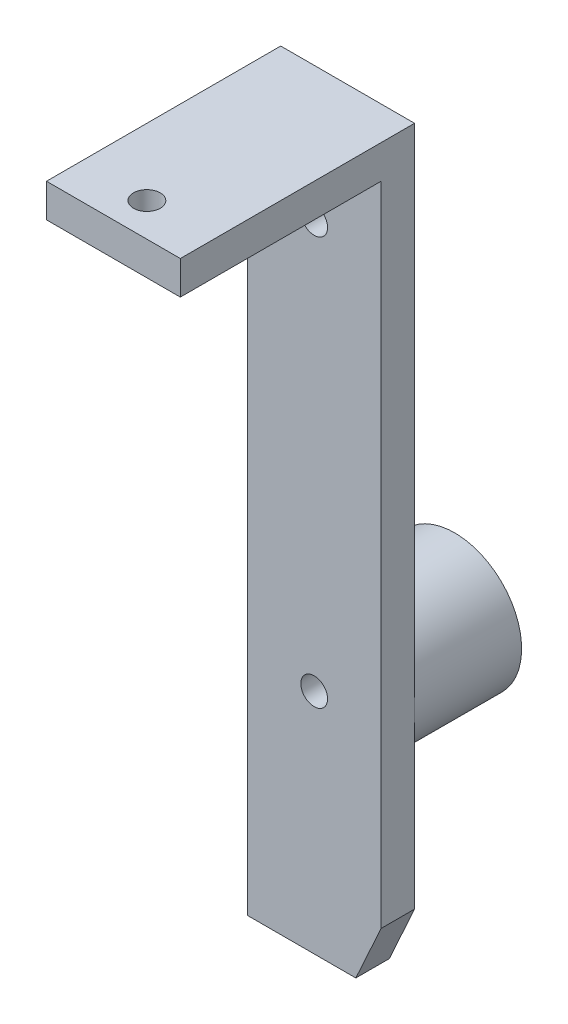
ISO-10303-21;
HEADER;
FILE_DESCRIPTION(('STEP AP214'),'2;1');
FILE_NAME('part.step','',(''),(''),'','','');
FILE_SCHEMA(('AUTOMOTIVE_DESIGN { 1 0 10303 214 1 1 1 1 }'));
ENDSEC;
DATA;
#1=APPLICATION_CONTEXT('core data for automotive mechanical design processes');
#2=APPLICATION_PROTOCOL_DEFINITION('international standard','automotive_design',2000,#1);
#3=PRODUCT_CONTEXT('',#1,'mechanical');
#4=PRODUCT('Part','Part','',(#3));
#5=PRODUCT_RELATED_PRODUCT_CATEGORY('part','',(#4));
#6=PRODUCT_DEFINITION_FORMATION('','',#4);
#7=PRODUCT_DEFINITION_CONTEXT('part definition',#1,'design');
#8=PRODUCT_DEFINITION('design','',#6,#7);
#9=PRODUCT_DEFINITION_SHAPE('','',#8);
#10=(LENGTH_UNIT() NAMED_UNIT(*) SI_UNIT(.MILLI.,.METRE.));
#11=(NAMED_UNIT(*) PLANE_ANGLE_UNIT() SI_UNIT($,.RADIAN.));
#12=(NAMED_UNIT(*) SI_UNIT($,.STERADIAN.) SOLID_ANGLE_UNIT());
#13=UNCERTAINTY_MEASURE_WITH_UNIT(LENGTH_MEASURE(1.E-05),#10,'distance_accuracy_value','');
#14=(GEOMETRIC_REPRESENTATION_CONTEXT(3) GLOBAL_UNCERTAINTY_ASSIGNED_CONTEXT((#13)) GLOBAL_UNIT_ASSIGNED_CONTEXT((#10,
#11,#12)) REPRESENTATION_CONTEXT('',''));
#15=CARTESIAN_POINT('',(0.,0.,0.));
#16=DIRECTION('',(0.,0.,1.));
#17=DIRECTION('',(1.,0.,0.));
#18=AXIS2_PLACEMENT_3D('',#15,#16,#17);
#19=CARTESIAN_POINT('',(6.35,69.85,-1.5875));
#20=DIRECTION('',(0.,0.,1.));
#21=DIRECTION('',(1.,0.,0.));
#22=AXIS2_PLACEMENT_3D('',#19,#20,#21);
#23=PLANE('',#22);
#24=CARTESIAN_POINT('',(0.,21.59,-1.5875));
#25=DIRECTION('',(0.,0.,-1.));
#26=DIRECTION('',(-1.,0.,0.));
#27=AXIS2_PLACEMENT_3D('',#24,#25,#26);
#28=CIRCLE('',#27,6.35);
#29=CARTESIAN_POINT('',(-6.34999999999999,21.59,-1.5875));
#30=VERTEX_POINT('',#29);
#31=CARTESIAN_POINT('',(6.35,21.59,-1.5875));
#32=VERTEX_POINT('',#31);
#33=EDGE_CURVE('E202',#30,#32,#28,.T.);
#34=ORIENTED_EDGE('',*,*,#33,.F.);
#35=DIRECTION('',(0.,-1.,0.));
#36=VECTOR('',#35,1.);
#37=CARTESIAN_POINT('',(-6.35,69.85,-1.5875));
#38=LINE('',#37,#36);
#39=CARTESIAN_POINT('',(-6.35,69.85,-1.5875));
#40=VERTEX_POINT('',#39);
#41=EDGE_CURVE('E135',#40,#30,#38,.T.);
#42=ORIENTED_EDGE('',*,*,#41,.F.);
#43=DIRECTION('',(-1.,0.,0.));
#44=VECTOR('',#43,1.);
#45=CARTESIAN_POINT('',(6.35,69.85,-1.5875));
#46=LINE('',#45,#44);
#47=CARTESIAN_POINT('',(6.35,69.85,-1.5875));
#48=VERTEX_POINT('',#47);
#49=EDGE_CURVE('E150',#48,#40,#46,.T.);
#50=ORIENTED_EDGE('',*,*,#49,.F.);
#51=DIRECTION('',(0.,-1.,0.));
#52=VECTOR('',#51,1.);
#53=CARTESIAN_POINT('',(6.35,69.85,-1.5875));
#54=LINE('',#53,#52);
#55=EDGE_CURVE('E127',#48,#32,#54,.T.);
#56=ORIENTED_EDGE('',*,*,#55,.T.);
#57=EDGE_LOOP('',(#34,#42,#50,#56));
#58=FACE_BOUND('',#57,.T.);
#59=CARTESIAN_POINT('',(0.,60.325,-1.5875));
#60=DIRECTION('',(0.,0.,1.));
#61=DIRECTION('',(1.,0.,0.));
#62=AXIS2_PLACEMENT_3D('',#59,#60,#61);
#63=CIRCLE('',#62,1.27);
#64=CARTESIAN_POINT('',(1.27,60.325,-1.5875));
#65=VERTEX_POINT('',#64);
#66=EDGE_CURVE('E194',#65,#65,#63,.T.);
#67=ORIENTED_EDGE('',*,*,#66,.T.);
#68=EDGE_LOOP('',(#67));
#69=FACE_BOUND('',#68,.T.);
#70=ADVANCED_FACE('F39',(#58,#69),#23,.F.);
#71=CARTESIAN_POINT('',(6.35,69.85,1.5875));
#72=DIRECTION('',(0.,0.,-1.));
#73=DIRECTION('',(-1.,0.,0.));
#74=AXIS2_PLACEMENT_3D('',#71,#72,#73);
#75=PLANE('',#74);
#76=CARTESIAN_POINT('',(0.,21.59,1.5875));
#77=DIRECTION('',(0.,0.,1.));
#78=DIRECTION('',(1.,0.,0.));
#79=AXIS2_PLACEMENT_3D('',#76,#77,#78);
#80=CIRCLE('',#79,1.27);
#81=CARTESIAN_POINT('',(1.27000000000001,21.59,1.5875));
#82=VERTEX_POINT('',#81);
#83=EDGE_CURVE('E186',#82,#82,#80,.T.);
#84=ORIENTED_EDGE('',*,*,#83,.F.);
#85=EDGE_LOOP('',(#84));
#86=FACE_BOUND('',#85,.T.);
#87=CARTESIAN_POINT('',(0.,60.325,1.5875));
#88=DIRECTION('',(0.,0.,1.));
#89=DIRECTION('',(1.,0.,0.));
#90=AXIS2_PLACEMENT_3D('',#87,#88,#89);
#91=CIRCLE('',#90,1.27);
#92=CARTESIAN_POINT('',(1.27,60.325,1.5875));
#93=VERTEX_POINT('',#92);
#94=EDGE_CURVE('E190',#93,#93,#91,.T.);
#95=ORIENTED_EDGE('',*,*,#94,.F.);
#96=EDGE_LOOP('',(#95));
#97=FACE_BOUND('',#96,.T.);
#98=DIRECTION('',(1.,0.,0.));
#99=VECTOR('',#98,1.);
#100=CARTESIAN_POINT('',(6.35,0.,1.5875));
#101=LINE('',#100,#99);
#102=CARTESIAN_POINT('',(-6.35,0.,1.5875));
#103=VERTEX_POINT('',#102);
#104=CARTESIAN_POINT('',(3.95148272282649,0.,1.5875));
#105=VERTEX_POINT('',#104);
#106=EDGE_CURVE('E117',#103,#105,#101,.T.);
#107=ORIENTED_EDGE('',*,*,#106,.T.);
#108=DIRECTION('',(-0.414132590750487,-0.910216566141426,0.));
#109=VECTOR('',#108,1.);
#110=CARTESIAN_POINT('',(3.95148272282649,0.,1.5875));
#111=LINE('',#110,#109);
#112=CARTESIAN_POINT('',(6.35,5.27166952956644,1.5875));
#113=VERTEX_POINT('',#112);
#114=EDGE_CURVE('E55',#113,#105,#111,.T.);
#115=ORIENTED_EDGE('',*,*,#114,.F.);
#116=DIRECTION('',(0.,-1.,0.));
#117=VECTOR('',#116,1.);
#118=CARTESIAN_POINT('',(6.35,69.85,1.5875));
#119=LINE('',#118,#117);
#120=CARTESIAN_POINT('',(6.35,66.675,1.5875));
#121=VERTEX_POINT('',#120);
#122=EDGE_CURVE('E114',#121,#113,#119,.T.);
#123=ORIENTED_EDGE('',*,*,#122,.F.);
#124=DIRECTION('',(1.,0.,0.));
#125=VECTOR('',#124,1.);
#126=CARTESIAN_POINT('',(-6.35,66.675,1.5875));
#127=LINE('',#126,#125);
#128=CARTESIAN_POINT('',(-6.35,66.675,1.5875));
#129=VERTEX_POINT('',#128);
#130=EDGE_CURVE('E164',#129,#121,#127,.T.);
#131=ORIENTED_EDGE('',*,*,#130,.F.);
#132=DIRECTION('',(0.,-1.,0.));
#133=VECTOR('',#132,1.);
#134=CARTESIAN_POINT('',(-6.35,69.85,1.5875));
#135=LINE('',#134,#133);
#136=EDGE_CURVE('E126',#129,#103,#135,.T.);
#137=ORIENTED_EDGE('',*,*,#136,.T.);
#138=EDGE_LOOP('',(#107,#115,#123,#131,#137));
#139=FACE_BOUND('',#138,.T.);
#140=ADVANCED_FACE('F113',(#86,#97,#139),#75,.F.);
#141=CARTESIAN_POINT('',(-6.35,69.85,1.5875));
#142=DIRECTION('',(1.,0.,0.));
#143=DIRECTION('',(0.,0.,-1.));
#144=AXIS2_PLACEMENT_3D('',#141,#142,#143);
#145=PLANE('',#144);
#146=DIRECTION('',(0.,0.,1.));
#147=VECTOR('',#146,1.);
#148=CARTESIAN_POINT('',(-6.35,0.,1.5875));
#149=LINE('',#148,#147);
#150=CARTESIAN_POINT('',(-6.35,0.,-1.5875));
#151=VERTEX_POINT('',#150);
#152=EDGE_CURVE('E145',#151,#103,#149,.T.);
#153=ORIENTED_EDGE('',*,*,#152,.T.);
#154=ORIENTED_EDGE('',*,*,#136,.F.);
#155=DIRECTION('',(0.,0.,-1.));
#156=VECTOR('',#155,1.);
#157=CARTESIAN_POINT('',(-6.35,66.675,20.6375));
#158=LINE('',#157,#156);
#159=CARTESIAN_POINT('',(-6.35,66.675,20.6375));
#160=VERTEX_POINT('',#159);
#161=EDGE_CURVE('E149',#160,#129,#158,.T.);
#162=ORIENTED_EDGE('',*,*,#161,.F.);
#163=DIRECTION('',(0.,-1.,0.));
#164=VECTOR('',#163,1.);
#165=CARTESIAN_POINT('',(-6.35,69.85,20.6375));
#166=LINE('',#165,#164);
#167=CARTESIAN_POINT('',(-6.35,69.85,20.6375));
#168=VERTEX_POINT('',#167);
#169=EDGE_CURVE('E167',#168,#160,#166,.T.);
#170=ORIENTED_EDGE('',*,*,#169,.F.);
#171=DIRECTION('',(0.,0.,1.));
#172=VECTOR('',#171,1.);
#173=CARTESIAN_POINT('',(-6.35,69.85,1.5875));
#174=LINE('',#173,#172);
#175=EDGE_CURVE('E142',#40,#168,#174,.T.);
#176=ORIENTED_EDGE('',*,*,#175,.F.);
#177=ORIENTED_EDGE('',*,*,#41,.T.);
#178=EDGE_CURVE('E138',#30,#151,#38,.T.);
#179=ORIENTED_EDGE('',*,*,#178,.T.);
#180=EDGE_LOOP('',(#153,#154,#162,#170,#176,#177,#179));
#181=FACE_BOUND('',#180,.T.);
#182=ADVANCED_FACE('F41',(#181),#145,.F.);
#183=CARTESIAN_POINT('',(6.35,69.85,1.5875));
#184=DIRECTION('',(-1.,0.,0.));
#185=DIRECTION('',(0.,0.,1.));
#186=AXIS2_PLACEMENT_3D('',#183,#184,#185);
#187=PLANE('',#186);
#188=ORIENTED_EDGE('',*,*,#122,.T.);
#189=DIRECTION('',(0.,0.,1.));
#190=VECTOR('',#189,1.);
#191=CARTESIAN_POINT('',(6.35,5.27166952956644,-11.7475));
#192=LINE('',#191,#190);
#193=CARTESIAN_POINT('',(6.35,5.27166952956644,-1.5875));
#194=VERTEX_POINT('',#193);
#195=EDGE_CURVE('E103',#194,#113,#192,.T.);
#196=ORIENTED_EDGE('',*,*,#195,.F.);
#197=EDGE_CURVE('E132',#32,#194,#54,.T.);
#198=ORIENTED_EDGE('',*,*,#197,.F.);
#199=ORIENTED_EDGE('',*,*,#55,.F.);
#200=DIRECTION('',(0.,0.,-1.));
#201=VECTOR('',#200,1.);
#202=CARTESIAN_POINT('',(6.35,69.85,1.5875));
#203=LINE('',#202,#201);
#204=CARTESIAN_POINT('',(6.35,69.85,20.6375));
#205=VERTEX_POINT('',#204);
#206=EDGE_CURVE('E153',#205,#48,#203,.T.);
#207=ORIENTED_EDGE('',*,*,#206,.F.);
#208=DIRECTION('',(0.,1.,0.));
#209=VECTOR('',#208,1.);
#210=CARTESIAN_POINT('',(6.35,69.85,20.6375));
#211=LINE('',#210,#209);
#212=CARTESIAN_POINT('',(6.35,66.675,20.6375));
#213=VERTEX_POINT('',#212);
#214=EDGE_CURVE('E172',#213,#205,#211,.T.);
#215=ORIENTED_EDGE('',*,*,#214,.F.);
#216=DIRECTION('',(0.,0.,-1.));
#217=VECTOR('',#216,1.);
#218=CARTESIAN_POINT('',(6.35,66.675,20.6375));
#219=LINE('',#218,#217);
#220=EDGE_CURVE('E124',#213,#121,#219,.T.);
#221=ORIENTED_EDGE('',*,*,#220,.T.);
#222=EDGE_LOOP('',(#188,#196,#198,#199,#207,#215,#221));
#223=FACE_BOUND('',#222,.T.);
#224=ADVANCED_FACE('F121',(#223),#187,.F.);
#225=ORIENTED_EDGE('',*,*,#197,.T.);
#226=DIRECTION('',(-0.414132590750487,-0.910216566141426,0.));
#227=VECTOR('',#226,1.);
#228=CARTESIAN_POINT('',(30.6928239296993,58.7744415942404,-1.5875));
#229=LINE('',#228,#227);
#230=CARTESIAN_POINT('',(3.95148272282649,0.,-1.5875));
#231=VERTEX_POINT('',#230);
#232=EDGE_CURVE('E106',#194,#231,#229,.T.);
#233=ORIENTED_EDGE('',*,*,#232,.T.);
#234=DIRECTION('',(-1.,0.,0.));
#235=VECTOR('',#234,1.);
#236=CARTESIAN_POINT('',(6.35,0.,-1.5875));
#237=LINE('',#236,#235);
#238=EDGE_CURVE('E139',#231,#151,#237,.T.);
#239=ORIENTED_EDGE('',*,*,#238,.T.);
#240=ORIENTED_EDGE('',*,*,#178,.F.);
#241=EDGE_CURVE('E48',#32,#30,#28,.T.);
#242=ORIENTED_EDGE('',*,*,#241,.F.);
#243=EDGE_LOOP('',(#225,#233,#239,#240,#242));
#244=FACE_BOUND('',#243,.T.);
#245=ADVANCED_FACE('F215',(#244),#23,.F.);
#246=CARTESIAN_POINT('',(0.,69.85,0.));
#247=DIRECTION('',(0.,1.,0.));
#248=DIRECTION('',(0.,0.,1.));
#249=AXIS2_PLACEMENT_3D('',#246,#247,#248);
#250=PLANE('',#249);
#251=CARTESIAN_POINT('',(0.,69.85,17.4625));
#252=DIRECTION('',(0.,-1.,0.));
#253=DIRECTION('',(0.,0.,-1.));
#254=AXIS2_PLACEMENT_3D('',#251,#252,#253);
#255=CIRCLE('',#254,1.27);
#256=CARTESIAN_POINT('',(0.,69.85,16.1925));
#257=VERTEX_POINT('',#256);
#258=EDGE_CURVE('E168',#257,#257,#255,.T.);
#259=ORIENTED_EDGE('',*,*,#258,.T.);
#260=EDGE_LOOP('',(#259));
#261=FACE_BOUND('',#260,.T.);
#262=ORIENTED_EDGE('',*,*,#175,.T.);
#263=DIRECTION('',(-1.,0.,0.));
#264=VECTOR('',#263,1.);
#265=CARTESIAN_POINT('',(-6.35,69.85,20.6375));
#266=LINE('',#265,#264);
#267=EDGE_CURVE('E163',#205,#168,#266,.T.);
#268=ORIENTED_EDGE('',*,*,#267,.F.);
#269=ORIENTED_EDGE('',*,*,#206,.T.);
#270=ORIENTED_EDGE('',*,*,#49,.T.);
#271=EDGE_LOOP('',(#262,#268,#269,#270));
#272=FACE_BOUND('',#271,.T.);
#273=ADVANCED_FACE('F258',(#261,#272),#250,.T.);
#274=CARTESIAN_POINT('',(0.,0.,0.));
#275=DIRECTION('',(0.,1.,0.));
#276=DIRECTION('',(0.,0.,1.));
#277=AXIS2_PLACEMENT_3D('',#274,#275,#276);
#278=PLANE('',#277);
#279=ORIENTED_EDGE('',*,*,#238,.F.);
#280=DIRECTION('',(0.,0.,1.));
#281=VECTOR('',#280,1.);
#282=CARTESIAN_POINT('',(3.95148272282649,0.,0.));
#283=LINE('',#282,#281);
#284=EDGE_CURVE('E11',#231,#105,#283,.T.);
#285=ORIENTED_EDGE('',*,*,#284,.T.);
#286=ORIENTED_EDGE('',*,*,#106,.F.);
#287=ORIENTED_EDGE('',*,*,#152,.F.);
#288=EDGE_LOOP('',(#279,#285,#286,#287));
#289=FACE_BOUND('',#288,.T.);
#290=ADVANCED_FACE('F219',(#289),#278,.F.);
#291=CARTESIAN_POINT('',(-6.35,66.675,20.6375));
#292=DIRECTION('',(0.,1.,0.));
#293=DIRECTION('',(0.,0.,1.));
#294=AXIS2_PLACEMENT_3D('',#291,#292,#293);
#295=PLANE('',#294);
#296=CARTESIAN_POINT('',(0.,66.675,17.4625));
#297=DIRECTION('',(0.,-1.,0.));
#298=DIRECTION('',(0.,0.,-1.));
#299=AXIS2_PLACEMENT_3D('',#296,#297,#298);
#300=CIRCLE('',#299,1.27);
#301=CARTESIAN_POINT('',(0.,66.675,16.1925));
#302=VERTEX_POINT('',#301);
#303=EDGE_CURVE('E182',#302,#302,#300,.T.);
#304=ORIENTED_EDGE('',*,*,#303,.F.);
#305=EDGE_LOOP('',(#304));
#306=FACE_BOUND('',#305,.T.);
#307=ORIENTED_EDGE('',*,*,#130,.T.);
#308=ORIENTED_EDGE('',*,*,#220,.F.);
#309=DIRECTION('',(1.,0.,0.));
#310=VECTOR('',#309,1.);
#311=CARTESIAN_POINT('',(-6.35,66.675,20.6375));
#312=LINE('',#311,#310);
#313=EDGE_CURVE('E176',#160,#213,#312,.T.);
#314=ORIENTED_EDGE('',*,*,#313,.F.);
#315=ORIENTED_EDGE('',*,*,#161,.T.);
#316=EDGE_LOOP('',(#307,#308,#314,#315));
#317=FACE_BOUND('',#316,.T.);
#318=ADVANCED_FACE('F298',(#306,#317),#295,.F.);
#319=CARTESIAN_POINT('',(0.,0.,20.6375));
#320=DIRECTION('',(0.,0.,1.));
#321=DIRECTION('',(1.,0.,0.));
#322=AXIS2_PLACEMENT_3D('',#319,#320,#321);
#323=PLANE('',#322);
#324=ORIENTED_EDGE('',*,*,#169,.T.);
#325=ORIENTED_EDGE('',*,*,#313,.T.);
#326=ORIENTED_EDGE('',*,*,#214,.T.);
#327=ORIENTED_EDGE('',*,*,#267,.T.);
#328=EDGE_LOOP('',(#324,#325,#326,#327));
#329=FACE_BOUND('',#328,.T.);
#330=ADVANCED_FACE('F343',(#329),#323,.T.);
#331=CARTESIAN_POINT('',(0.,69.85,17.4625));
#332=DIRECTION('',(0.,-1.,0.));
#333=DIRECTION('',(0.,0.,-1.));
#334=AXIS2_PLACEMENT_3D('',#331,#332,#333);
#335=CYLINDRICAL_SURFACE('',#334,1.27);
#336=ORIENTED_EDGE('',*,*,#258,.F.);
#337=EDGE_LOOP('',(#336));
#338=FACE_BOUND('',#337,.T.);
#339=ORIENTED_EDGE('',*,*,#303,.T.);
#340=EDGE_LOOP('',(#339));
#341=FACE_BOUND('',#340,.T.);
#342=ADVANCED_FACE('F333',(#338,#341),#335,.F.);
#343=CARTESIAN_POINT('',(0.,60.325,-1.5875));
#344=DIRECTION('',(0.,0.,1.));
#345=DIRECTION('',(1.,0.,0.));
#346=AXIS2_PLACEMENT_3D('',#343,#344,#345);
#347=CYLINDRICAL_SURFACE('',#346,1.27);
#348=ORIENTED_EDGE('',*,*,#66,.F.);
#349=EDGE_LOOP('',(#348));
#350=FACE_BOUND('',#349,.T.);
#351=ORIENTED_EDGE('',*,*,#94,.T.);
#352=EDGE_LOOP('',(#351));
#353=FACE_BOUND('',#352,.T.);
#354=ADVANCED_FACE('F320',(#350,#353),#347,.F.);
#355=CARTESIAN_POINT('',(0.,21.59,-1.5875));
#356=DIRECTION('',(0.,0.,1.));
#357=DIRECTION('',(1.,0.,0.));
#358=AXIS2_PLACEMENT_3D('',#355,#356,#357);
#359=CYLINDRICAL_SURFACE('',#358,1.27);
#360=ORIENTED_EDGE('',*,*,#83,.T.);
#361=EDGE_LOOP('',(#360));
#362=FACE_BOUND('',#361,.T.);
#363=CARTESIAN_POINT('',(0.,21.59,-11.7475));
#364=DIRECTION('',(0.,0.,-1.));
#365=DIRECTION('',(-1.,0.,0.));
#366=AXIS2_PLACEMENT_3D('',#363,#364,#365);
#367=CIRCLE('',#366,1.27);
#368=CARTESIAN_POINT('',(-1.27,21.59,-11.7475));
#369=VERTEX_POINT('',#368);
#370=EDGE_CURVE('E206',#369,#369,#367,.T.);
#371=ORIENTED_EDGE('',*,*,#370,.T.);
#372=EDGE_LOOP('',(#371));
#373=FACE_BOUND('',#372,.T.);
#374=ADVANCED_FACE('F244',(#362,#373),#359,.F.);
#375=CARTESIAN_POINT('',(0.,21.59,-11.7475));
#376=DIRECTION('',(0.,0.,-1.));
#377=DIRECTION('',(-1.,0.,0.));
#378=AXIS2_PLACEMENT_3D('',#375,#376,#377);
#379=PLANE('',#378);
#380=CARTESIAN_POINT('',(0.,21.59,-11.7475));
#381=DIRECTION('',(0.,0.,-1.));
#382=DIRECTION('',(-1.,0.,0.));
#383=AXIS2_PLACEMENT_3D('',#380,#381,#382);
#384=CIRCLE('',#383,6.35);
#385=CARTESIAN_POINT('',(-6.35,21.59,-11.7475));
#386=VERTEX_POINT('',#385);
#387=EDGE_CURVE('E195',#386,#386,#384,.T.);
#388=ORIENTED_EDGE('',*,*,#387,.T.);
#389=EDGE_LOOP('',(#388));
#390=FACE_BOUND('',#389,.T.);
#391=ORIENTED_EDGE('',*,*,#370,.F.);
#392=EDGE_LOOP('',(#391));
#393=FACE_BOUND('',#392,.T.);
#394=ADVANCED_FACE('F236',(#390,#393),#379,.T.);
#395=CARTESIAN_POINT('',(0.,21.59,-11.7475));
#396=DIRECTION('',(0.,0.,1.));
#397=DIRECTION('',(1.,0.,0.));
#398=AXIS2_PLACEMENT_3D('',#395,#396,#397);
#399=CYLINDRICAL_SURFACE('',#398,6.35);
#400=ORIENTED_EDGE('',*,*,#387,.F.);
#401=EDGE_LOOP('',(#400));
#402=FACE_BOUND('',#401,.T.);
#403=ORIENTED_EDGE('',*,*,#33,.T.);
#404=ORIENTED_EDGE('',*,*,#241,.T.);
#405=EDGE_LOOP('',(#403,#404));
#406=FACE_BOUND('',#405,.T.);
#407=ADVANCED_FACE('F233',(#402,#406),#399,.T.);
#408=CARTESIAN_POINT('',(3.95148272282649,0.,-11.7475));
#409=DIRECTION('',(-0.910216566141426,0.414132590750487,0.));
#410=DIRECTION('',(-0.414132590750487,-0.910216566141426,0.));
#411=AXIS2_PLACEMENT_3D('',#408,#409,#410);
#412=PLANE('',#411);
#413=ORIENTED_EDGE('',*,*,#195,.T.);
#414=ORIENTED_EDGE('',*,*,#114,.T.);
#415=ORIENTED_EDGE('',*,*,#284,.F.);
#416=ORIENTED_EDGE('',*,*,#232,.F.);
#417=EDGE_LOOP('',(#413,#414,#415,#416));
#418=FACE_BOUND('',#417,.T.);
#419=ADVANCED_FACE('F104',(#418),#412,.F.);
#420=CLOSED_SHELL('',(#70,#140,#182,#224,#245,#273,#290,#318,#330,#342,#354,#374,#394,#407,#419));
#421=MANIFOLD_SOLID_BREP('B2',#420);
#422=ADVANCED_BREP_SHAPE_REPRESENTATION('',(#18,#421),#14);
#423=SHAPE_DEFINITION_REPRESENTATION(#9,#422);
ENDSEC;
END-ISO-10303-21;
